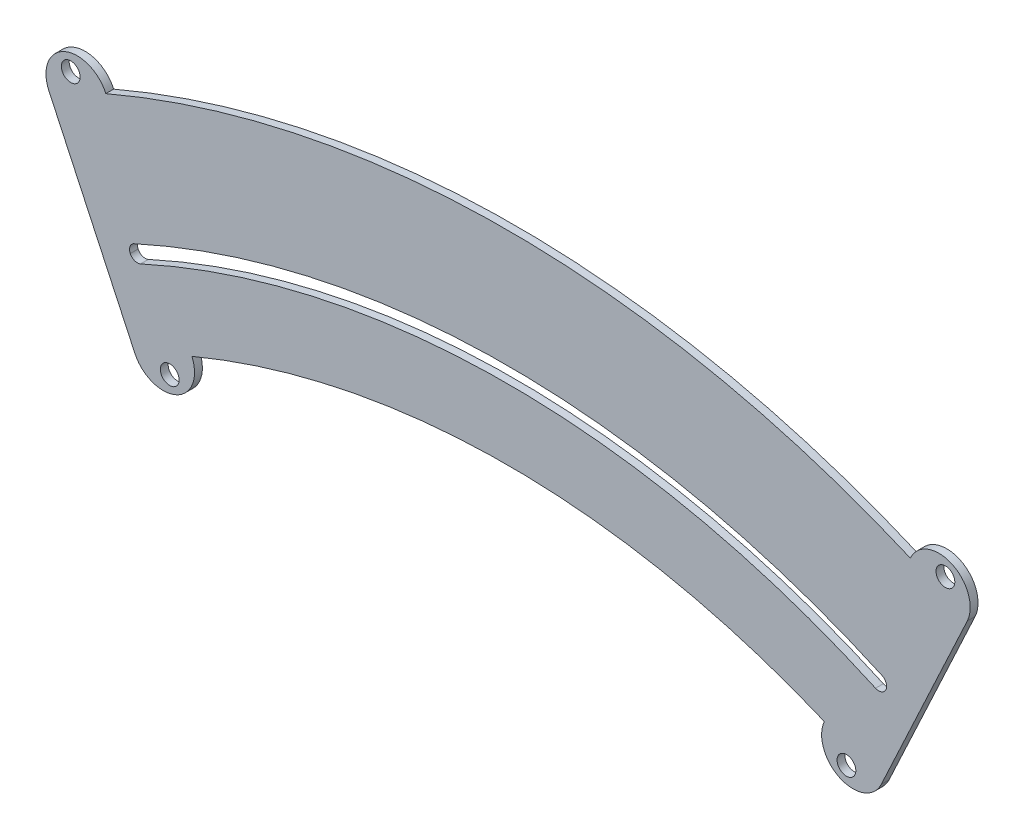
ISO-10303-21;
HEADER;
FILE_DESCRIPTION(('STEP AP214'),'2;1');
FILE_NAME('part.step','',(''),(''),'','','');
FILE_SCHEMA(('AUTOMOTIVE_DESIGN { 1 0 10303 214 1 1 1 1 }'));
ENDSEC;
DATA;
#1=APPLICATION_CONTEXT('core data for automotive mechanical design processes');
#2=APPLICATION_PROTOCOL_DEFINITION('international standard','automotive_design',2000,#1);
#3=PRODUCT_CONTEXT('',#1,'mechanical');
#4=PRODUCT('Part','Part','',(#3));
#5=PRODUCT_RELATED_PRODUCT_CATEGORY('part','',(#4));
#6=PRODUCT_DEFINITION_FORMATION('','',#4);
#7=PRODUCT_DEFINITION_CONTEXT('part definition',#1,'design');
#8=PRODUCT_DEFINITION('design','',#6,#7);
#9=PRODUCT_DEFINITION_SHAPE('','',#8);
#10=(LENGTH_UNIT() NAMED_UNIT(*) SI_UNIT(.MILLI.,.METRE.));
#11=(NAMED_UNIT(*) PLANE_ANGLE_UNIT() SI_UNIT($,.RADIAN.));
#12=(NAMED_UNIT(*) SI_UNIT($,.STERADIAN.) SOLID_ANGLE_UNIT());
#13=UNCERTAINTY_MEASURE_WITH_UNIT(LENGTH_MEASURE(1.E-05),#10,'distance_accuracy_value','');
#14=(GEOMETRIC_REPRESENTATION_CONTEXT(3) GLOBAL_UNCERTAINTY_ASSIGNED_CONTEXT((#13)) GLOBAL_UNIT_ASSIGNED_CONTEXT((#10,
#11,#12)) REPRESENTATION_CONTEXT('',''));
#15=CARTESIAN_POINT('',(0.,0.,0.));
#16=DIRECTION('',(0.,0.,1.));
#17=DIRECTION('',(1.,0.,0.));
#18=AXIS2_PLACEMENT_3D('',#15,#16,#17);
#19=CARTESIAN_POINT('',(0.,0.,5.));
#20=DIRECTION('',(0.,0.,1.));
#21=DIRECTION('',(1.,0.,0.));
#22=AXIS2_PLACEMENT_3D('',#19,#20,#21);
#23=PLANE('',#22);
#24=CARTESIAN_POINT('',(279.424662082145,599.409767995056,5.));
#25=DIRECTION('',(0.,0.,1.));
#26=DIRECTION('',(1.,0.,0.));
#27=AXIS2_PLACEMENT_3D('',#24,#25,#26);
#28=CIRCLE('',#27,5.99999999999999);
#29=CARTESIAN_POINT('',(285.424662082145,599.409767995056,5.));
#30=VERTEX_POINT('',#29);
#31=EDGE_CURVE('E198',#30,#30,#28,.T.);
#32=ORIENTED_EDGE('',*,*,#31,.F.);
#33=EDGE_LOOP('',(#32));
#34=FACE_BOUND('',#33,.T.);
#35=CARTESIAN_POINT('',(216.188741333995,463.391306898477,5.));
#36=DIRECTION('',(0.,0.,1.));
#37=DIRECTION('',(1.,0.,0.));
#38=AXIS2_PLACEMENT_3D('',#35,#36,#37);
#39=CIRCLE('',#38,6.00000000000002);
#40=CARTESIAN_POINT('',(222.188741333995,463.391306898477,5.));
#41=VERTEX_POINT('',#40);
#42=EDGE_CURVE('E213',#41,#41,#39,.T.);
#43=ORIENTED_EDGE('',*,*,#42,.F.);
#44=EDGE_LOOP('',(#43));
#45=FACE_BOUND('',#44,.T.);
#46=CARTESIAN_POINT('',(-216.188741333995,463.391306898477,5.));
#47=DIRECTION('',(0.,0.,1.));
#48=DIRECTION('',(1.,0.,0.));
#49=AXIS2_PLACEMENT_3D('',#46,#47,#48);
#50=CIRCLE('',#49,6.00000000000002);
#51=CARTESIAN_POINT('',(-210.188741333995,463.391306898477,5.));
#52=VERTEX_POINT('',#51);
#53=EDGE_CURVE('E219',#52,#52,#50,.T.);
#54=ORIENTED_EDGE('',*,*,#53,.F.);
#55=EDGE_LOOP('',(#54));
#56=FACE_BOUND('',#55,.T.);
#57=CARTESIAN_POINT('',(-279.424662082146,599.409767995056,5.));
#58=DIRECTION('',(0.,0.,1.));
#59=DIRECTION('',(1.,0.,0.));
#60=AXIS2_PLACEMENT_3D('',#57,#58,#59);
#61=CIRCLE('',#60,5.99999999999999);
#62=CARTESIAN_POINT('',(-273.424662082146,599.409767995056,5.));
#63=VERTEX_POINT('',#62);
#64=EDGE_CURVE('E225',#63,#63,#61,.T.);
#65=ORIENTED_EDGE('',*,*,#64,.F.);
#66=EDGE_LOOP('',(#65));
#67=FACE_BOUND('',#66,.T.);
#68=CARTESIAN_POINT('',(275.268178602188,590.314514008452,5.));
#69=DIRECTION('',(0.,0.,1.));
#70=DIRECTION('',(1.,0.,0.));
#71=AXIS2_PLACEMENT_3D('',#68,#69,#70);
#72=CIRCLE('',#71,19.9999999999999);
#73=CARTESIAN_POINT('',(293.394334342921,581.862148773639,5.));
#74=VERTEX_POINT('',#73);
#75=CARTESIAN_POINT('',(257.014390412658,598.487592787695,5.));
#76=VERTEX_POINT('',#75);
#77=EDGE_CURVE('E238',#74,#76,#72,.T.);
#78=ORIENTED_EDGE('',*,*,#77,.T.);
#79=CARTESIAN_POINT('',(0.,0.,5.));
#80=DIRECTION('',(0.,0.,1.));
#81=DIRECTION('',(1.,0.,0.));
#82=AXIS2_PLACEMENT_3D('',#79,#80,#81);
#83=CIRCLE('',#82,651.34);
#84=CARTESIAN_POINT('',(-257.014390412657,598.487592787696,5.));
#85=VERTEX_POINT('',#84);
#86=EDGE_CURVE('E43',#76,#85,#83,.T.);
#87=ORIENTED_EDGE('',*,*,#86,.T.);
#88=CARTESIAN_POINT('',(-275.268178602188,590.314514008451,5.));
#89=DIRECTION('',(0.,0.,1.));
#90=DIRECTION('',(1.,0.,0.));
#91=AXIS2_PLACEMENT_3D('',#88,#89,#90);
#92=CIRCLE('',#91,20.);
#93=CARTESIAN_POINT('',(-293.394334342921,581.862148773637,5.));
#94=VERTEX_POINT('',#93);
#95=EDGE_CURVE('E231',#85,#94,#92,.T.);
#96=ORIENTED_EDGE('',*,*,#95,.T.);
#97=DIRECTION('',(0.422618261740704,-0.906307787036648,0.));
#98=VECTOR('',#97,1.);
#99=CARTESIAN_POINT('',(-293.394334342921,581.862148773637,5.));
#100=LINE('',#99,#98);
#101=CARTESIAN_POINT('',(-238.45396031663,464.042136458873,5.));
#102=VERTEX_POINT('',#101);
#103=EDGE_CURVE('E256',#94,#102,#100,.T.);
#104=ORIENTED_EDGE('',*,*,#103,.T.);
#105=CARTESIAN_POINT('',(-220.327804575897,472.494501693687,5.));
#106=DIRECTION('',(0.,0.,1.));
#107=DIRECTION('',(1.,0.,0.));
#108=AXIS2_PLACEMENT_3D('',#105,#106,#107);
#109=CIRCLE('',#108,19.9999999999996);
#110=CARTESIAN_POINT('',(-202.042855969471,480.59762790894,5.));
#111=VERTEX_POINT('',#110);
#112=EDGE_CURVE('E259',#102,#111,#109,.T.);
#113=ORIENTED_EDGE('',*,*,#112,.T.);
#114=CARTESIAN_POINT('',(0.,0.,5.));
#115=DIRECTION('',(0.,0.,1.));
#116=DIRECTION('',(1.,0.,0.));
#117=AXIS2_PLACEMENT_3D('',#114,#115,#116);
#118=CIRCLE('',#117,521.34);
#119=CARTESIAN_POINT('',(202.04285596947,480.59762790894,5.));
#120=VERTEX_POINT('',#119);
#121=EDGE_CURVE('E11',#120,#111,#118,.T.);
#122=ORIENTED_EDGE('',*,*,#121,.F.);
#123=CARTESIAN_POINT('',(220.327804575897,472.494501693687,5.));
#124=DIRECTION('',(0.,0.,1.));
#125=DIRECTION('',(1.,0.,0.));
#126=AXIS2_PLACEMENT_3D('',#123,#124,#125);
#127=CIRCLE('',#126,19.9999999999997);
#128=CARTESIAN_POINT('',(238.453960316629,464.042136458873,5.));
#129=VERTEX_POINT('',#128);
#130=EDGE_CURVE('E262',#120,#129,#127,.T.);
#131=ORIENTED_EDGE('',*,*,#130,.T.);
#132=DIRECTION('',(0.422618261740699,0.90630778703665,0.));
#133=VECTOR('',#132,1.);
#134=CARTESIAN_POINT('',(293.394334342921,581.862148773639,5.));
#135=LINE('',#134,#133);
#136=EDGE_CURVE('E265',#129,#74,#135,.T.);
#137=ORIENTED_EDGE('',*,*,#136,.T.);
#138=EDGE_LOOP('',(#78,#87,#96,#104,#113,#122,#131,#137));
#139=FACE_BOUND('',#138,.T.);
#140=CARTESIAN_POINT('',(236.857624915648,519.930631064682,5.));
#141=DIRECTION('',(0.,0.,1.));
#142=DIRECTION('',(1.,0.,0.));
#143=AXIS2_PLACEMENT_3D('',#140,#141,#142);
#144=CIRCLE('',#143,4.99999999999999);
#145=CARTESIAN_POINT('',(234.784799409683,515.380532777631,5.));
#146=VERTEX_POINT('',#145);
#147=CARTESIAN_POINT('',(241.380121813848,517.798256377679,5.));
#148=VERTEX_POINT('',#147);
#149=EDGE_CURVE('E184',#146,#148,#144,.T.);
#150=ORIENTED_EDGE('',*,*,#149,.F.);
#151=CARTESIAN_POINT('',(0.,0.,5.));
#152=DIRECTION('',(0.,0.,1.));
#153=DIRECTION('',(1.,0.,0.));
#154=AXIS2_PLACEMENT_3D('',#151,#152,#153);
#155=CIRCLE('',#154,566.34);
#156=CARTESIAN_POINT('',(-234.784799409683,515.380532777631,5.));
#157=VERTEX_POINT('',#156);
#158=EDGE_CURVE('E51',#146,#157,#155,.T.);
#159=ORIENTED_EDGE('',*,*,#158,.T.);
#160=CARTESIAN_POINT('',(-236.857624915648,519.930631064682,5.));
#161=DIRECTION('',(0.,0.,1.));
#162=DIRECTION('',(1.,0.,0.));
#163=AXIS2_PLACEMENT_3D('',#160,#161,#162);
#164=CIRCLE('',#163,4.99999999999999);
#165=CARTESIAN_POINT('',(-241.380121813856,517.798256377696,5.));
#166=VERTEX_POINT('',#165);
#167=EDGE_CURVE('E167',#166,#157,#164,.T.);
#168=ORIENTED_EDGE('',*,*,#167,.F.);
#169=DIRECTION('',(-0.422513056368824,0.906356837673703,0.));
#170=VECTOR('',#169,1.);
#171=CARTESIAN_POINT('',(7.94692436914887E-11,3.70458870543631E-11,5.));
#172=LINE('',#171,#170);
#173=CARTESIAN_POINT('',(-241.398609625684,517.837915636531,5.));
#174=VERTEX_POINT('',#173);
#175=EDGE_CURVE('E170',#166,#174,#172,.T.);
#176=ORIENTED_EDGE('',*,*,#175,.T.);
#177=CARTESIAN_POINT('',(-238.930450421614,524.480729351732,5.));
#178=VERTEX_POINT('',#177);
#179=EDGE_CURVE('E172',#178,#174,#164,.T.);
#180=ORIENTED_EDGE('',*,*,#179,.F.);
#181=CARTESIAN_POINT('',(0.,0.,5.));
#182=DIRECTION('',(0.,0.,1.));
#183=DIRECTION('',(1.,0.,0.));
#184=AXIS2_PLACEMENT_3D('',#181,#182,#183);
#185=CIRCLE('',#184,576.34);
#186=CARTESIAN_POINT('',(238.930450421613,524.480729351732,5.));
#187=VERTEX_POINT('',#186);
#188=EDGE_CURVE('E190',#187,#178,#185,.T.);
#189=ORIENTED_EDGE('',*,*,#188,.F.);
#190=CARTESIAN_POINT('',(241.398609625684,517.837915636531,5.));
#191=VERTEX_POINT('',#190);
#192=EDGE_CURVE('E187',#191,#187,#144,.T.);
#193=ORIENTED_EDGE('',*,*,#192,.F.);
#194=DIRECTION('',(0.422513056368882,0.906356837673676,0.));
#195=VECTOR('',#194,1.);
#196=CARTESIAN_POINT('',(-1.13279520209801E-10,5.28071001601203E-11,5.));
#197=LINE('',#196,#195);
#198=EDGE_CURVE('E186',#148,#191,#197,.T.);
#199=ORIENTED_EDGE('',*,*,#198,.F.);
#200=EDGE_LOOP('',(#150,#159,#168,#176,#180,#189,#193,#199));
#201=FACE_BOUND('',#200,.T.);
#202=ADVANCED_FACE('F34',(#34,#45,#56,#67,#139,#201),#23,.T.);
#203=CARTESIAN_POINT('',(0.,0.,0.));
#204=DIRECTION('',(0.,0.,1.));
#205=DIRECTION('',(1.,0.,0.));
#206=AXIS2_PLACEMENT_3D('',#203,#204,#205);
#207=PLANE('',#206);
#208=CARTESIAN_POINT('',(279.424662082145,599.409767995056,0.));
#209=DIRECTION('',(0.,0.,1.));
#210=DIRECTION('',(1.,0.,0.));
#211=AXIS2_PLACEMENT_3D('',#208,#209,#210);
#212=CIRCLE('',#211,5.99999999999999);
#213=CARTESIAN_POINT('',(285.424662082145,599.409767995056,0.));
#214=VERTEX_POINT('',#213);
#215=EDGE_CURVE('E210',#214,#214,#212,.T.);
#216=ORIENTED_EDGE('',*,*,#215,.T.);
#217=EDGE_LOOP('',(#216));
#218=FACE_BOUND('',#217,.T.);
#219=CARTESIAN_POINT('',(216.188741333995,463.391306898477,0.));
#220=DIRECTION('',(0.,0.,1.));
#221=DIRECTION('',(1.,0.,0.));
#222=AXIS2_PLACEMENT_3D('',#219,#220,#221);
#223=CIRCLE('',#222,6.00000000000002);
#224=CARTESIAN_POINT('',(222.188741333995,463.391306898477,0.));
#225=VERTEX_POINT('',#224);
#226=EDGE_CURVE('E216',#225,#225,#223,.T.);
#227=ORIENTED_EDGE('',*,*,#226,.T.);
#228=EDGE_LOOP('',(#227));
#229=FACE_BOUND('',#228,.T.);
#230=CARTESIAN_POINT('',(-216.188741333995,463.391306898477,0.));
#231=DIRECTION('',(0.,0.,1.));
#232=DIRECTION('',(1.,0.,0.));
#233=AXIS2_PLACEMENT_3D('',#230,#231,#232);
#234=CIRCLE('',#233,6.00000000000002);
#235=CARTESIAN_POINT('',(-210.188741333995,463.391306898477,0.));
#236=VERTEX_POINT('',#235);
#237=EDGE_CURVE('E222',#236,#236,#234,.T.);
#238=ORIENTED_EDGE('',*,*,#237,.T.);
#239=EDGE_LOOP('',(#238));
#240=FACE_BOUND('',#239,.T.);
#241=CARTESIAN_POINT('',(-279.424662082146,599.409767995056,0.));
#242=DIRECTION('',(0.,0.,1.));
#243=DIRECTION('',(1.,0.,0.));
#244=AXIS2_PLACEMENT_3D('',#241,#242,#243);
#245=CIRCLE('',#244,5.99999999999999);
#246=CARTESIAN_POINT('',(-273.424662082146,599.409767995056,0.));
#247=VERTEX_POINT('',#246);
#248=EDGE_CURVE('E228',#247,#247,#245,.T.);
#249=ORIENTED_EDGE('',*,*,#248,.T.);
#250=EDGE_LOOP('',(#249));
#251=FACE_BOUND('',#250,.T.);
#252=CARTESIAN_POINT('',(0.,0.,0.));
#253=DIRECTION('',(0.,0.,1.));
#254=DIRECTION('',(1.,0.,0.));
#255=AXIS2_PLACEMENT_3D('',#252,#253,#254);
#256=CIRCLE('',#255,651.34);
#257=CARTESIAN_POINT('',(257.014390412658,598.487592787695,0.));
#258=VERTEX_POINT('',#257);
#259=CARTESIAN_POINT('',(-257.014390412657,598.487592787696,0.));
#260=VERTEX_POINT('',#259);
#261=EDGE_CURVE('E272',#258,#260,#256,.T.);
#262=ORIENTED_EDGE('',*,*,#261,.F.);
#263=CARTESIAN_POINT('',(275.268178602188,590.314514008452,0.));
#264=DIRECTION('',(0.,0.,1.));
#265=DIRECTION('',(1.,0.,0.));
#266=AXIS2_PLACEMENT_3D('',#263,#264,#265);
#267=CIRCLE('',#266,19.9999999999999);
#268=CARTESIAN_POINT('',(293.394334342921,581.862148773639,0.));
#269=VERTEX_POINT('',#268);
#270=EDGE_CURVE('E250',#269,#258,#267,.T.);
#271=ORIENTED_EDGE('',*,*,#270,.F.);
#272=DIRECTION('',(0.422618261740699,0.90630778703665,0.));
#273=VECTOR('',#272,1.);
#274=CARTESIAN_POINT('',(293.394334342921,581.862148773639,0.));
#275=LINE('',#274,#273);
#276=CARTESIAN_POINT('',(238.453960316629,464.042136458873,0.));
#277=VERTEX_POINT('',#276);
#278=EDGE_CURVE('E247',#277,#269,#275,.T.);
#279=ORIENTED_EDGE('',*,*,#278,.F.);
#280=CARTESIAN_POINT('',(220.327804575897,472.494501693687,0.));
#281=DIRECTION('',(0.,0.,1.));
#282=DIRECTION('',(1.,0.,0.));
#283=AXIS2_PLACEMENT_3D('',#280,#281,#282);
#284=CIRCLE('',#283,19.9999999999997);
#285=CARTESIAN_POINT('',(202.04285596947,480.59762790894,0.));
#286=VERTEX_POINT('',#285);
#287=EDGE_CURVE('E244',#286,#277,#284,.T.);
#288=ORIENTED_EDGE('',*,*,#287,.F.);
#289=CARTESIAN_POINT('',(0.,0.,0.));
#290=DIRECTION('',(0.,0.,1.));
#291=DIRECTION('',(1.,0.,0.));
#292=AXIS2_PLACEMENT_3D('',#289,#290,#291);
#293=CIRCLE('',#292,521.34);
#294=CARTESIAN_POINT('',(-202.042855969471,480.59762790894,0.));
#295=VERTEX_POINT('',#294);
#296=EDGE_CURVE('E38',#286,#295,#293,.T.);
#297=ORIENTED_EDGE('',*,*,#296,.T.);
#298=CARTESIAN_POINT('',(-220.327804575897,472.494501693687,0.));
#299=DIRECTION('',(0.,0.,1.));
#300=DIRECTION('',(1.,0.,0.));
#301=AXIS2_PLACEMENT_3D('',#298,#299,#300);
#302=CIRCLE('',#301,19.9999999999996);
#303=CARTESIAN_POINT('',(-238.45396031663,464.042136458873,0.));
#304=VERTEX_POINT('',#303);
#305=EDGE_CURVE('E241',#304,#295,#302,.T.);
#306=ORIENTED_EDGE('',*,*,#305,.F.);
#307=DIRECTION('',(0.422618261740704,-0.906307787036648,0.));
#308=VECTOR('',#307,1.);
#309=CARTESIAN_POINT('',(-293.394334342921,581.862148773637,0.));
#310=LINE('',#309,#308);
#311=CARTESIAN_POINT('',(-293.394334342921,581.862148773637,0.));
#312=VERTEX_POINT('',#311);
#313=EDGE_CURVE('E237',#312,#304,#310,.T.);
#314=ORIENTED_EDGE('',*,*,#313,.F.);
#315=CARTESIAN_POINT('',(-275.268178602188,590.314514008451,0.));
#316=DIRECTION('',(0.,0.,1.));
#317=DIRECTION('',(1.,0.,0.));
#318=AXIS2_PLACEMENT_3D('',#315,#316,#317);
#319=CIRCLE('',#318,20.);
#320=EDGE_CURVE('E234',#260,#312,#319,.T.);
#321=ORIENTED_EDGE('',*,*,#320,.F.);
#322=EDGE_LOOP('',(#262,#271,#279,#288,#297,#306,#314,#321));
#323=FACE_BOUND('',#322,.T.);
#324=CARTESIAN_POINT('',(0.,0.,0.));
#325=DIRECTION('',(0.,0.,1.));
#326=DIRECTION('',(1.,0.,0.));
#327=AXIS2_PLACEMENT_3D('',#324,#325,#326);
#328=CIRCLE('',#327,566.34);
#329=CARTESIAN_POINT('',(234.784799409683,515.380532777631,0.));
#330=VERTEX_POINT('',#329);
#331=CARTESIAN_POINT('',(-234.784799409683,515.380532777631,0.));
#332=VERTEX_POINT('',#331);
#333=EDGE_CURVE('E149',#330,#332,#328,.T.);
#334=ORIENTED_EDGE('',*,*,#333,.F.);
#335=CARTESIAN_POINT('',(236.857624915648,519.930631064682,0.));
#336=DIRECTION('',(0.,0.,1.));
#337=DIRECTION('',(1.,0.,0.));
#338=AXIS2_PLACEMENT_3D('',#335,#336,#337);
#339=CIRCLE('',#338,4.99999999999999);
#340=CARTESIAN_POINT('',(241.380121813848,517.798256377679,0.));
#341=VERTEX_POINT('',#340);
#342=EDGE_CURVE('E158',#330,#341,#339,.T.);
#343=ORIENTED_EDGE('',*,*,#342,.T.);
#344=DIRECTION('',(0.422513056368882,0.906356837673676,0.));
#345=VECTOR('',#344,1.);
#346=CARTESIAN_POINT('',(-1.13279520209801E-10,5.28071001601203E-11,0.));
#347=LINE('',#346,#345);
#348=CARTESIAN_POINT('',(241.398609625684,517.837915636531,0.));
#349=VERTEX_POINT('',#348);
#350=EDGE_CURVE('E59',#341,#349,#347,.T.);
#351=ORIENTED_EDGE('',*,*,#350,.T.);
#352=CARTESIAN_POINT('',(238.930450421613,524.480729351732,0.));
#353=VERTEX_POINT('',#352);
#354=EDGE_CURVE('E162',#349,#353,#339,.T.);
#355=ORIENTED_EDGE('',*,*,#354,.T.);
#356=CARTESIAN_POINT('',(0.,0.,0.));
#357=DIRECTION('',(0.,0.,1.));
#358=DIRECTION('',(1.,0.,0.));
#359=AXIS2_PLACEMENT_3D('',#356,#357,#358);
#360=CIRCLE('',#359,576.34);
#361=CARTESIAN_POINT('',(-238.930450421614,524.480729351732,0.));
#362=VERTEX_POINT('',#361);
#363=EDGE_CURVE('E175',#353,#362,#360,.T.);
#364=ORIENTED_EDGE('',*,*,#363,.T.);
#365=CARTESIAN_POINT('',(-236.857624915648,519.930631064682,0.));
#366=DIRECTION('',(0.,0.,1.));
#367=DIRECTION('',(1.,0.,0.));
#368=AXIS2_PLACEMENT_3D('',#365,#366,#367);
#369=CIRCLE('',#368,4.99999999999999);
#370=CARTESIAN_POINT('',(-241.398609625684,517.837915636531,0.));
#371=VERTEX_POINT('',#370);
#372=EDGE_CURVE('E178',#362,#371,#369,.T.);
#373=ORIENTED_EDGE('',*,*,#372,.T.);
#374=DIRECTION('',(-0.422513056368824,0.906356837673703,0.));
#375=VECTOR('',#374,1.);
#376=CARTESIAN_POINT('',(7.94692436914887E-11,3.70458870543631E-11,0.));
#377=LINE('',#376,#375);
#378=CARTESIAN_POINT('',(-241.380121813856,517.798256377696,0.));
#379=VERTEX_POINT('',#378);
#380=EDGE_CURVE('E181',#379,#371,#377,.T.);
#381=ORIENTED_EDGE('',*,*,#380,.F.);
#382=EDGE_CURVE('E155',#379,#332,#369,.T.);
#383=ORIENTED_EDGE('',*,*,#382,.T.);
#384=EDGE_LOOP('',(#334,#343,#351,#355,#364,#373,#381,#383));
#385=FACE_BOUND('',#384,.T.);
#386=ADVANCED_FACE('F164',(#218,#229,#240,#251,#323,#385),#207,.F.);
#387=CARTESIAN_POINT('',(275.268178602188,590.314514008452,0.));
#388=DIRECTION('',(0.,0.,1.));
#389=DIRECTION('',(1.,0.,0.));
#390=AXIS2_PLACEMENT_3D('',#387,#388,#389);
#391=CYLINDRICAL_SURFACE('',#390,19.9999999999999);
#392=ORIENTED_EDGE('',*,*,#77,.F.);
#393=DIRECTION('',(0.,0.,1.));
#394=VECTOR('',#393,1.);
#395=CARTESIAN_POINT('',(293.394334342921,581.862148773639,0.));
#396=LINE('',#395,#394);
#397=EDGE_CURVE('E276',#269,#74,#396,.T.);
#398=ORIENTED_EDGE('',*,*,#397,.F.);
#399=ORIENTED_EDGE('',*,*,#270,.T.);
#400=DIRECTION('',(0.,0.,1.));
#401=VECTOR('',#400,1.);
#402=CARTESIAN_POINT('',(257.014390412657,598.487592787696,0.));
#403=LINE('',#402,#401);
#404=EDGE_CURVE('E273',#258,#76,#403,.T.);
#405=ORIENTED_EDGE('',*,*,#404,.T.);
#406=EDGE_LOOP('',(#392,#398,#399,#405));
#407=FACE_BOUND('',#406,.T.);
#408=ADVANCED_FACE('F316',(#407),#391,.T.);
#409=CARTESIAN_POINT('',(293.394334342921,581.862148773639,0.));
#410=DIRECTION('',(0.90630778703665,-0.422618261740699,0.));
#411=DIRECTION('',(0.422618261740699,0.90630778703665,0.));
#412=AXIS2_PLACEMENT_3D('',#409,#410,#411);
#413=PLANE('',#412);
#414=ORIENTED_EDGE('',*,*,#136,.F.);
#415=DIRECTION('',(0.,0.,1.));
#416=VECTOR('',#415,1.);
#417=CARTESIAN_POINT('',(238.453960316629,464.042136458873,0.));
#418=LINE('',#417,#416);
#419=EDGE_CURVE('E278',#277,#129,#418,.T.);
#420=ORIENTED_EDGE('',*,*,#419,.F.);
#421=ORIENTED_EDGE('',*,*,#278,.T.);
#422=ORIENTED_EDGE('',*,*,#397,.T.);
#423=EDGE_LOOP('',(#414,#420,#421,#422));
#424=FACE_BOUND('',#423,.T.);
#425=ADVANCED_FACE('F319',(#424),#413,.T.);
#426=CARTESIAN_POINT('',(220.327804575897,472.494501693687,0.));
#427=DIRECTION('',(0.,0.,1.));
#428=DIRECTION('',(1.,0.,0.));
#429=AXIS2_PLACEMENT_3D('',#426,#427,#428);
#430=CYLINDRICAL_SURFACE('',#429,19.9999999999997);
#431=ORIENTED_EDGE('',*,*,#130,.F.);
#432=DIRECTION('',(0.,0.,1.));
#433=VECTOR('',#432,1.);
#434=CARTESIAN_POINT('',(202.04285596947,480.59762790894,0.));
#435=LINE('',#434,#433);
#436=EDGE_CURVE('E280',#286,#120,#435,.T.);
#437=ORIENTED_EDGE('',*,*,#436,.F.);
#438=ORIENTED_EDGE('',*,*,#287,.T.);
#439=ORIENTED_EDGE('',*,*,#419,.T.);
#440=EDGE_LOOP('',(#431,#437,#438,#439));
#441=FACE_BOUND('',#440,.T.);
#442=ADVANCED_FACE('F322',(#441),#430,.T.);
#443=CARTESIAN_POINT('',(216.188741333995,463.391306898477,0.));
#444=DIRECTION('',(0.,0.,1.));
#445=DIRECTION('',(1.,0.,0.));
#446=AXIS2_PLACEMENT_3D('',#443,#444,#445);
#447=CYLINDRICAL_SURFACE('',#446,6.00000000000002);
#448=ORIENTED_EDGE('',*,*,#226,.F.);
#449=EDGE_LOOP('',(#448));
#450=FACE_BOUND('',#449,.T.);
#451=ORIENTED_EDGE('',*,*,#42,.T.);
#452=EDGE_LOOP('',(#451));
#453=FACE_BOUND('',#452,.T.);
#454=ADVANCED_FACE('F350',(#450,#453),#447,.F.);
#455=CARTESIAN_POINT('',(279.424662082145,599.409767995056,0.));
#456=DIRECTION('',(0.,0.,1.));
#457=DIRECTION('',(1.,0.,0.));
#458=AXIS2_PLACEMENT_3D('',#455,#456,#457);
#459=CYLINDRICAL_SURFACE('',#458,5.99999999999999);
#460=ORIENTED_EDGE('',*,*,#215,.F.);
#461=EDGE_LOOP('',(#460));
#462=FACE_BOUND('',#461,.T.);
#463=ORIENTED_EDGE('',*,*,#31,.T.);
#464=EDGE_LOOP('',(#463));
#465=FACE_BOUND('',#464,.T.);
#466=ADVANCED_FACE('F331',(#462,#465),#459,.F.);
#467=CARTESIAN_POINT('',(0.,0.,5.));
#468=DIRECTION('',(0.,0.,-1.));
#469=DIRECTION('',(-1.,0.,0.));
#470=AXIS2_PLACEMENT_3D('',#467,#468,#469);
#471=CYLINDRICAL_SURFACE('',#470,651.34);
#472=ORIENTED_EDGE('',*,*,#261,.T.);
#473=DIRECTION('',(0.,0.,1.));
#474=VECTOR('',#473,1.);
#475=CARTESIAN_POINT('',(-257.014390412657,598.487592787696,0.));
#476=LINE('',#475,#474);
#477=EDGE_CURVE('E270',#260,#85,#476,.T.);
#478=ORIENTED_EDGE('',*,*,#477,.T.);
#479=ORIENTED_EDGE('',*,*,#86,.F.);
#480=ORIENTED_EDGE('',*,*,#404,.F.);
#481=EDGE_LOOP('',(#472,#478,#479,#480));
#482=FACE_BOUND('',#481,.T.);
#483=ADVANCED_FACE('F36',(#482),#471,.T.);
#484=CARTESIAN_POINT('',(0.,0.,5.));
#485=DIRECTION('',(0.,0.,-1.));
#486=DIRECTION('',(-1.,0.,0.));
#487=AXIS2_PLACEMENT_3D('',#484,#485,#486);
#488=CYLINDRICAL_SURFACE('',#487,521.34);
#489=ORIENTED_EDGE('',*,*,#436,.T.);
#490=ORIENTED_EDGE('',*,*,#121,.T.);
#491=DIRECTION('',(0.,0.,1.));
#492=VECTOR('',#491,1.);
#493=CARTESIAN_POINT('',(-202.042855969471,480.59762790894,0.));
#494=LINE('',#493,#492);
#495=EDGE_CURVE('E283',#295,#111,#494,.T.);
#496=ORIENTED_EDGE('',*,*,#495,.F.);
#497=ORIENTED_EDGE('',*,*,#296,.F.);
#498=EDGE_LOOP('',(#489,#490,#496,#497));
#499=FACE_BOUND('',#498,.T.);
#500=ADVANCED_FACE('F323',(#499),#488,.F.);
#501=CARTESIAN_POINT('',(-293.394334342921,581.862148773637,0.));
#502=DIRECTION('',(-0.906307787036648,-0.422618261740704,0.));
#503=DIRECTION('',(0.422618261740704,-0.906307787036648,0.));
#504=AXIS2_PLACEMENT_3D('',#501,#502,#503);
#505=PLANE('',#504);
#506=ORIENTED_EDGE('',*,*,#103,.F.);
#507=DIRECTION('',(0.,0.,1.));
#508=VECTOR('',#507,1.);
#509=CARTESIAN_POINT('',(-293.394334342921,581.862148773637,0.));
#510=LINE('',#509,#508);
#511=EDGE_CURVE('E253',#312,#94,#510,.T.);
#512=ORIENTED_EDGE('',*,*,#511,.F.);
#513=ORIENTED_EDGE('',*,*,#313,.T.);
#514=DIRECTION('',(0.,0.,1.));
#515=VECTOR('',#514,1.);
#516=CARTESIAN_POINT('',(-238.45396031663,464.042136458873,0.));
#517=LINE('',#516,#515);
#518=EDGE_CURVE('E286',#304,#102,#517,.T.);
#519=ORIENTED_EDGE('',*,*,#518,.T.);
#520=EDGE_LOOP('',(#506,#512,#513,#519));
#521=FACE_BOUND('',#520,.T.);
#522=ADVANCED_FACE('F306',(#521),#505,.T.);
#523=CARTESIAN_POINT('',(-216.188741333995,463.391306898477,0.));
#524=DIRECTION('',(0.,0.,1.));
#525=DIRECTION('',(1.,0.,0.));
#526=AXIS2_PLACEMENT_3D('',#523,#524,#525);
#527=CYLINDRICAL_SURFACE('',#526,6.00000000000002);
#528=ORIENTED_EDGE('',*,*,#237,.F.);
#529=EDGE_LOOP('',(#528));
#530=FACE_BOUND('',#529,.T.);
#531=ORIENTED_EDGE('',*,*,#53,.T.);
#532=EDGE_LOOP('',(#531));
#533=FACE_BOUND('',#532,.T.);
#534=ADVANCED_FACE('F329',(#530,#533),#527,.F.);
#535=CARTESIAN_POINT('',(-279.424662082146,599.409767995056,0.));
#536=DIRECTION('',(0.,0.,1.));
#537=DIRECTION('',(1.,0.,0.));
#538=AXIS2_PLACEMENT_3D('',#535,#536,#537);
#539=CYLINDRICAL_SURFACE('',#538,5.99999999999999);
#540=ORIENTED_EDGE('',*,*,#248,.F.);
#541=EDGE_LOOP('',(#540));
#542=FACE_BOUND('',#541,.T.);
#543=ORIENTED_EDGE('',*,*,#64,.T.);
#544=EDGE_LOOP('',(#543));
#545=FACE_BOUND('',#544,.T.);
#546=ADVANCED_FACE('F347',(#542,#545),#539,.F.);
#547=CARTESIAN_POINT('',(-220.327804575897,472.494501693687,0.));
#548=DIRECTION('',(0.,0.,1.));
#549=DIRECTION('',(1.,0.,0.));
#550=AXIS2_PLACEMENT_3D('',#547,#548,#549);
#551=CYLINDRICAL_SURFACE('',#550,19.9999999999996);
#552=ORIENTED_EDGE('',*,*,#112,.F.);
#553=ORIENTED_EDGE('',*,*,#518,.F.);
#554=ORIENTED_EDGE('',*,*,#305,.T.);
#555=ORIENTED_EDGE('',*,*,#495,.T.);
#556=EDGE_LOOP('',(#552,#553,#554,#555));
#557=FACE_BOUND('',#556,.T.);
#558=ADVANCED_FACE('F303',(#557),#551,.T.);
#559=CARTESIAN_POINT('',(-275.268178602188,590.314514008451,0.));
#560=DIRECTION('',(0.,0.,1.));
#561=DIRECTION('',(1.,0.,0.));
#562=AXIS2_PLACEMENT_3D('',#559,#560,#561);
#563=CYLINDRICAL_SURFACE('',#562,20.);
#564=ORIENTED_EDGE('',*,*,#95,.F.);
#565=ORIENTED_EDGE('',*,*,#477,.F.);
#566=ORIENTED_EDGE('',*,*,#320,.T.);
#567=ORIENTED_EDGE('',*,*,#511,.T.);
#568=EDGE_LOOP('',(#564,#565,#566,#567));
#569=FACE_BOUND('',#568,.T.);
#570=ADVANCED_FACE('F310',(#569),#563,.T.);
#571=CARTESIAN_POINT('',(0.,0.,0.));
#572=DIRECTION('',(0.,0.,1.));
#573=DIRECTION('',(1.,0.,0.));
#574=AXIS2_PLACEMENT_3D('',#571,#572,#573);
#575=CYLINDRICAL_SURFACE('',#574,566.34);
#576=ORIENTED_EDGE('',*,*,#158,.F.);
#577=DIRECTION('',(0.,0.,1.));
#578=VECTOR('',#577,1.);
#579=CARTESIAN_POINT('',(234.784799409683,515.380532777631,0.));
#580=LINE('',#579,#578);
#581=EDGE_CURVE('E145',#330,#146,#580,.T.);
#582=ORIENTED_EDGE('',*,*,#581,.F.);
#583=ORIENTED_EDGE('',*,*,#333,.T.);
#584=DIRECTION('',(0.,0.,1.));
#585=VECTOR('',#584,1.);
#586=CARTESIAN_POINT('',(-234.784799409683,515.380532777631,0.));
#587=LINE('',#586,#585);
#588=EDGE_CURVE('E196',#332,#157,#587,.T.);
#589=ORIENTED_EDGE('',*,*,#588,.T.);
#590=EDGE_LOOP('',(#576,#582,#583,#589));
#591=FACE_BOUND('',#590,.T.);
#592=ADVANCED_FACE('F147',(#591),#575,.T.);
#593=CARTESIAN_POINT('',(-236.857624915648,519.930631064682,0.));
#594=DIRECTION('',(0.,0.,1.));
#595=DIRECTION('',(1.,0.,0.));
#596=AXIS2_PLACEMENT_3D('',#593,#594,#595);
#597=CYLINDRICAL_SURFACE('',#596,4.99999999999999);
#598=ORIENTED_EDGE('',*,*,#167,.T.);
#599=ORIENTED_EDGE('',*,*,#588,.F.);
#600=ORIENTED_EDGE('',*,*,#382,.F.);
#601=DIRECTION('',(0.,0.,1.));
#602=VECTOR('',#601,1.);
#603=CARTESIAN_POINT('',(-241.380121813856,517.798256377696,0.));
#604=LINE('',#603,#602);
#605=EDGE_CURVE('E199',#379,#166,#604,.T.);
#606=ORIENTED_EDGE('',*,*,#605,.T.);
#607=EDGE_LOOP('',(#598,#599,#600,#606));
#608=FACE_BOUND('',#607,.T.);
#609=ADVANCED_FACE('F369',(#608),#597,.F.);
#610=CARTESIAN_POINT('',(7.94692436914887E-11,3.70458870543631E-11,0.));
#611=DIRECTION('',(0.906356837673703,0.422513056368823,0.));
#612=DIRECTION('',(-0.422513056368824,0.906356837673703,0.));
#613=AXIS2_PLACEMENT_3D('',#610,#611,#612);
#614=PLANE('',#613);
#615=ORIENTED_EDGE('',*,*,#175,.F.);
#616=ORIENTED_EDGE('',*,*,#605,.F.);
#617=ORIENTED_EDGE('',*,*,#380,.T.);
#618=DIRECTION('',(0.,0.,1.));
#619=VECTOR('',#618,1.);
#620=CARTESIAN_POINT('',(-241.398609625684,517.837915636531,0.));
#621=LINE('',#620,#619);
#622=EDGE_CURVE('E201',#371,#174,#621,.T.);
#623=ORIENTED_EDGE('',*,*,#622,.T.);
#624=EDGE_LOOP('',(#615,#616,#617,#623));
#625=FACE_BOUND('',#624,.T.);
#626=ADVANCED_FACE('F382',(#625),#614,.T.);
#627=ORIENTED_EDGE('',*,*,#179,.T.);
#628=ORIENTED_EDGE('',*,*,#622,.F.);
#629=ORIENTED_EDGE('',*,*,#372,.F.);
#630=DIRECTION('',(0.,0.,1.));
#631=VECTOR('',#630,1.);
#632=CARTESIAN_POINT('',(-238.930450421614,524.480729351732,0.));
#633=LINE('',#632,#631);
#634=EDGE_CURVE('E203',#362,#178,#633,.T.);
#635=ORIENTED_EDGE('',*,*,#634,.T.);
#636=EDGE_LOOP('',(#627,#628,#629,#635));
#637=FACE_BOUND('',#636,.T.);
#638=ADVANCED_FACE('F380',(#637),#597,.F.);
#639=CARTESIAN_POINT('',(0.,0.,0.));
#640=DIRECTION('',(0.,0.,1.));
#641=DIRECTION('',(1.,0.,0.));
#642=AXIS2_PLACEMENT_3D('',#639,#640,#641);
#643=CYLINDRICAL_SURFACE('',#642,576.34);
#644=ORIENTED_EDGE('',*,*,#188,.T.);
#645=ORIENTED_EDGE('',*,*,#634,.F.);
#646=ORIENTED_EDGE('',*,*,#363,.F.);
#647=DIRECTION('',(0.,0.,1.));
#648=VECTOR('',#647,1.);
#649=CARTESIAN_POINT('',(238.930450421613,524.480729351732,0.));
#650=LINE('',#649,#648);
#651=EDGE_CURVE('E205',#353,#187,#650,.T.);
#652=ORIENTED_EDGE('',*,*,#651,.T.);
#653=EDGE_LOOP('',(#644,#645,#646,#652));
#654=FACE_BOUND('',#653,.T.);
#655=ADVANCED_FACE('F376',(#654),#643,.F.);
#656=CARTESIAN_POINT('',(236.857624915648,519.930631064682,0.));
#657=DIRECTION('',(0.,0.,1.));
#658=DIRECTION('',(1.,0.,0.));
#659=AXIS2_PLACEMENT_3D('',#656,#657,#658);
#660=CYLINDRICAL_SURFACE('',#659,4.99999999999999);
#661=ORIENTED_EDGE('',*,*,#192,.T.);
#662=ORIENTED_EDGE('',*,*,#651,.F.);
#663=ORIENTED_EDGE('',*,*,#354,.F.);
#664=DIRECTION('',(0.,0.,1.));
#665=VECTOR('',#664,1.);
#666=CARTESIAN_POINT('',(241.398609625684,517.837915636531,0.));
#667=LINE('',#666,#665);
#668=EDGE_CURVE('E207',#349,#191,#667,.T.);
#669=ORIENTED_EDGE('',*,*,#668,.T.);
#670=EDGE_LOOP('',(#661,#662,#663,#669));
#671=FACE_BOUND('',#670,.T.);
#672=ADVANCED_FACE('F373',(#671),#660,.F.);
#673=CARTESIAN_POINT('',(-1.13279520209801E-10,5.28071001601203E-11,0.));
#674=DIRECTION('',(0.906356837673676,-0.422513056368882,0.));
#675=DIRECTION('',(0.422513056368882,0.906356837673676,0.));
#676=AXIS2_PLACEMENT_3D('',#673,#674,#675);
#677=PLANE('',#676);
#678=ORIENTED_EDGE('',*,*,#198,.T.);
#679=ORIENTED_EDGE('',*,*,#668,.F.);
#680=ORIENTED_EDGE('',*,*,#350,.F.);
#681=DIRECTION('',(0.,0.,1.));
#682=VECTOR('',#681,1.);
#683=CARTESIAN_POINT('',(241.380121813848,517.798256377679,0.));
#684=LINE('',#683,#682);
#685=EDGE_CURVE('E154',#341,#148,#684,.T.);
#686=ORIENTED_EDGE('',*,*,#685,.T.);
#687=EDGE_LOOP('',(#678,#679,#680,#686));
#688=FACE_BOUND('',#687,.T.);
#689=ADVANCED_FACE('F370',(#688),#677,.F.);
#690=ORIENTED_EDGE('',*,*,#149,.T.);
#691=ORIENTED_EDGE('',*,*,#685,.F.);
#692=ORIENTED_EDGE('',*,*,#342,.F.);
#693=ORIENTED_EDGE('',*,*,#581,.T.);
#694=EDGE_LOOP('',(#690,#691,#692,#693));
#695=FACE_BOUND('',#694,.T.);
#696=ADVANCED_FACE('F159',(#695),#660,.F.);
#697=CLOSED_SHELL('',(#202,#386,#408,#425,#442,#454,#466,#483,#500,#522,#534,#546,#558,#570,
#592,#609,#626,#638,#655,#672,#689,#696));
#698=MANIFOLD_SOLID_BREP('B2',#697);
#699=ADVANCED_BREP_SHAPE_REPRESENTATION('',(#18,#698),#14);
#700=SHAPE_DEFINITION_REPRESENTATION(#9,#699);
ENDSEC;
END-ISO-10303-21;
